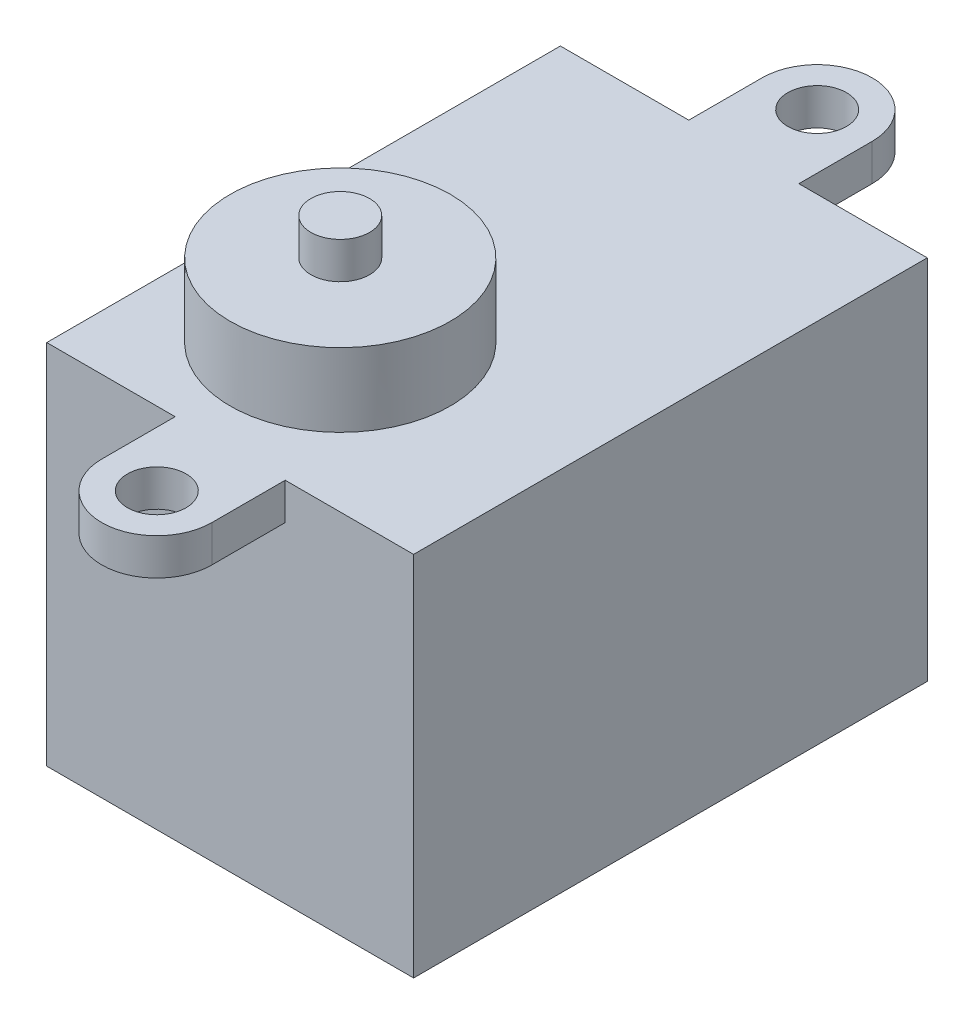
ISO-10303-21;
HEADER;
FILE_DESCRIPTION(('STEP AP214'),'2;1');
FILE_NAME('part.step','',(''),(''),'','','');
FILE_SCHEMA(('AUTOMOTIVE_DESIGN { 1 0 10303 214 1 1 1 1 }'));
ENDSEC;
DATA;
#1=APPLICATION_CONTEXT('core data for automotive mechanical design processes');
#2=APPLICATION_PROTOCOL_DEFINITION('international standard','automotive_design',2000,#1);
#3=PRODUCT_CONTEXT('',#1,'mechanical');
#4=PRODUCT('Part','Part','',(#3));
#5=PRODUCT_RELATED_PRODUCT_CATEGORY('part','',(#4));
#6=PRODUCT_DEFINITION_FORMATION('','',#4);
#7=PRODUCT_DEFINITION_CONTEXT('part definition',#1,'design');
#8=PRODUCT_DEFINITION('design','',#6,#7);
#9=PRODUCT_DEFINITION_SHAPE('','',#8);
#10=(LENGTH_UNIT() NAMED_UNIT(*) SI_UNIT(.MILLI.,.METRE.));
#11=(NAMED_UNIT(*) PLANE_ANGLE_UNIT() SI_UNIT($,.RADIAN.));
#12=(NAMED_UNIT(*) SI_UNIT($,.STERADIAN.) SOLID_ANGLE_UNIT());
#13=UNCERTAINTY_MEASURE_WITH_UNIT(LENGTH_MEASURE(1.E-05),#10,'distance_accuracy_value','');
#14=(GEOMETRIC_REPRESENTATION_CONTEXT(3) GLOBAL_UNCERTAINTY_ASSIGNED_CONTEXT((#13)) GLOBAL_UNIT_ASSIGNED_CONTEXT((#10,
#11,#12)) REPRESENTATION_CONTEXT('',''));
#15=CARTESIAN_POINT('',(0.,0.,0.));
#16=DIRECTION('',(0.,0.,1.));
#17=DIRECTION('',(1.,0.,0.));
#18=AXIS2_PLACEMENT_3D('',#15,#16,#17);
#19=CARTESIAN_POINT('',(0.,50.,0.));
#20=DIRECTION('',(0.,0.,-1.));
#21=DIRECTION('',(-1.,0.,0.));
#22=AXIS2_PLACEMENT_3D('',#19,#20,#21);
#23=PLANE('',#22);
#24=DIRECTION('',(0.,1.,0.));
#25=VECTOR('',#24,1.);
#26=CARTESIAN_POINT('',(32.5,45.,0.));
#27=LINE('',#26,#25);
#28=CARTESIAN_POINT('',(32.5,45.,0.));
#29=VERTEX_POINT('',#28);
#30=CARTESIAN_POINT('',(32.5,50.,0.));
#31=VERTEX_POINT('',#30);
#32=EDGE_CURVE('E189',#29,#31,#27,.T.);
#33=ORIENTED_EDGE('',*,*,#32,.F.);
#34=DIRECTION('',(1.,0.,0.));
#35=VECTOR('',#34,1.);
#36=CARTESIAN_POINT('',(17.5,45.,0.));
#37=LINE('',#36,#35);
#38=CARTESIAN_POINT('',(17.5,45.,0.));
#39=VERTEX_POINT('',#38);
#40=EDGE_CURVE('E169',#39,#29,#37,.T.);
#41=ORIENTED_EDGE('',*,*,#40,.F.);
#42=DIRECTION('',(0.,1.,0.));
#43=VECTOR('',#42,1.);
#44=CARTESIAN_POINT('',(17.5,45.,0.));
#45=LINE('',#44,#43);
#46=CARTESIAN_POINT('',(17.5,50.,0.));
#47=VERTEX_POINT('',#46);
#48=EDGE_CURVE('E172',#39,#47,#45,.T.);
#49=ORIENTED_EDGE('',*,*,#48,.T.);
#50=DIRECTION('',(1.,0.,0.));
#51=VECTOR('',#50,1.);
#52=CARTESIAN_POINT('',(0.,50.,0.));
#53=LINE('',#52,#51);
#54=CARTESIAN_POINT('',(0.,50.,0.));
#55=VERTEX_POINT('',#54);
#56=EDGE_CURVE('E203',#55,#47,#53,.T.);
#57=ORIENTED_EDGE('',*,*,#56,.F.);
#58=DIRECTION('',(0.,-1.,0.));
#59=VECTOR('',#58,1.);
#60=CARTESIAN_POINT('',(0.,50.,0.));
#61=LINE('',#60,#59);
#62=CARTESIAN_POINT('',(0.,0.,0.));
#63=VERTEX_POINT('',#62);
#64=EDGE_CURVE('E273',#55,#63,#61,.T.);
#65=ORIENTED_EDGE('',*,*,#64,.T.);
#66=DIRECTION('',(1.,0.,0.));
#67=VECTOR('',#66,1.);
#68=CARTESIAN_POINT('',(0.,0.,0.));
#69=LINE('',#68,#67);
#70=CARTESIAN_POINT('',(50.,0.,0.));
#71=VERTEX_POINT('',#70);
#72=EDGE_CURVE('E287',#63,#71,#69,.T.);
#73=ORIENTED_EDGE('',*,*,#72,.T.);
#74=DIRECTION('',(0.,-1.,0.));
#75=VECTOR('',#74,1.);
#76=CARTESIAN_POINT('',(50.,50.,0.));
#77=LINE('',#76,#75);
#78=CARTESIAN_POINT('',(50.,50.,0.));
#79=VERTEX_POINT('',#78);
#80=EDGE_CURVE('E276',#79,#71,#77,.T.);
#81=ORIENTED_EDGE('',*,*,#80,.F.);
#82=EDGE_CURVE('E207',#31,#79,#53,.T.);
#83=ORIENTED_EDGE('',*,*,#82,.F.);
#84=EDGE_LOOP('',(#33,#41,#49,#57,#65,#73,#81,#83));
#85=FACE_BOUND('',#84,.T.);
#86=ADVANCED_FACE('F35',(#85),#23,.F.);
#87=CARTESIAN_POINT('',(0.,50.,-70.));
#88=DIRECTION('',(0.,0.,1.));
#89=DIRECTION('',(1.,0.,0.));
#90=AXIS2_PLACEMENT_3D('',#87,#88,#89);
#91=PLANE('',#90);
#92=DIRECTION('',(0.,1.,0.));
#93=VECTOR('',#92,1.);
#94=CARTESIAN_POINT('',(17.5,45.,-70.));
#95=LINE('',#94,#93);
#96=CARTESIAN_POINT('',(17.5,45.,-70.));
#97=VERTEX_POINT('',#96);
#98=CARTESIAN_POINT('',(17.5,50.,-70.));
#99=VERTEX_POINT('',#98);
#100=EDGE_CURVE('E314',#97,#99,#95,.T.);
#101=ORIENTED_EDGE('',*,*,#100,.F.);
#102=DIRECTION('',(1.,0.,0.));
#103=VECTOR('',#102,1.);
#104=CARTESIAN_POINT('',(17.5,45.,-70.));
#105=LINE('',#104,#103);
#106=CARTESIAN_POINT('',(32.5,45.,-70.));
#107=VERTEX_POINT('',#106);
#108=EDGE_CURVE('E338',#97,#107,#105,.T.);
#109=ORIENTED_EDGE('',*,*,#108,.T.);
#110=DIRECTION('',(0.,1.,0.));
#111=VECTOR('',#110,1.);
#112=CARTESIAN_POINT('',(32.5,45.,-70.));
#113=LINE('',#112,#111);
#114=CARTESIAN_POINT('',(32.5,50.,-70.));
#115=VERTEX_POINT('',#114);
#116=EDGE_CURVE('E311',#107,#115,#113,.T.);
#117=ORIENTED_EDGE('',*,*,#116,.T.);
#118=DIRECTION('',(-1.,0.,0.));
#119=VECTOR('',#118,1.);
#120=CARTESIAN_POINT('',(0.,50.,-70.));
#121=LINE('',#120,#119);
#122=CARTESIAN_POINT('',(50.,50.,-70.));
#123=VERTEX_POINT('',#122);
#124=EDGE_CURVE('E228',#123,#115,#121,.T.);
#125=ORIENTED_EDGE('',*,*,#124,.F.);
#126=DIRECTION('',(0.,-1.,0.));
#127=VECTOR('',#126,1.);
#128=CARTESIAN_POINT('',(50.,50.,-70.));
#129=LINE('',#128,#127);
#130=CARTESIAN_POINT('',(50.,0.,-70.));
#131=VERTEX_POINT('',#130);
#132=EDGE_CURVE('E279',#123,#131,#129,.T.);
#133=ORIENTED_EDGE('',*,*,#132,.T.);
#134=DIRECTION('',(-1.,0.,0.));
#135=VECTOR('',#134,1.);
#136=CARTESIAN_POINT('',(0.,0.,-70.));
#137=LINE('',#136,#135);
#138=CARTESIAN_POINT('',(0.,0.,-70.));
#139=VERTEX_POINT('',#138);
#140=EDGE_CURVE('E284',#131,#139,#137,.T.);
#141=ORIENTED_EDGE('',*,*,#140,.T.);
#142=DIRECTION('',(0.,-1.,0.));
#143=VECTOR('',#142,1.);
#144=CARTESIAN_POINT('',(0.,50.,-70.));
#145=LINE('',#144,#143);
#146=CARTESIAN_POINT('',(0.,50.,-70.));
#147=VERTEX_POINT('',#146);
#148=EDGE_CURVE('E231',#147,#139,#145,.T.);
#149=ORIENTED_EDGE('',*,*,#148,.F.);
#150=EDGE_CURVE('E219',#99,#147,#121,.T.);
#151=ORIENTED_EDGE('',*,*,#150,.F.);
#152=EDGE_LOOP('',(#101,#109,#117,#125,#133,#141,#149,#151));
#153=FACE_BOUND('',#152,.T.);
#154=ADVANCED_FACE('F367',(#153),#91,.F.);
#155=CARTESIAN_POINT('',(20.,60.,-20.));
#156=DIRECTION('',(0.,1.,0.));
#157=DIRECTION('',(0.,0.,1.));
#158=AXIS2_PLACEMENT_3D('',#155,#156,#157);
#159=PLANE('',#158);
#160=CARTESIAN_POINT('',(20.,60.,-20.));
#161=DIRECTION('',(0.,1.,0.));
#162=DIRECTION('',(0.,0.,1.));
#163=AXIS2_PLACEMENT_3D('',#160,#161,#162);
#164=CIRCLE('',#163,15.);
#165=CARTESIAN_POINT('',(20.,60.,-5.));
#166=VERTEX_POINT('',#165);
#167=EDGE_CURVE('E291',#166,#166,#164,.T.);
#168=ORIENTED_EDGE('',*,*,#167,.T.);
#169=EDGE_LOOP('',(#168));
#170=FACE_BOUND('',#169,.T.);
#171=CARTESIAN_POINT('',(20.,60.,-20.));
#172=DIRECTION('',(0.,1.,0.));
#173=DIRECTION('',(0.,0.,1.));
#174=AXIS2_PLACEMENT_3D('',#171,#172,#173);
#175=CIRCLE('',#174,4.);
#176=CARTESIAN_POINT('',(20.,60.,-16.));
#177=VERTEX_POINT('',#176);
#178=EDGE_CURVE('E300',#177,#177,#175,.T.);
#179=ORIENTED_EDGE('',*,*,#178,.F.);
#180=EDGE_LOOP('',(#179));
#181=FACE_BOUND('',#180,.T.);
#182=ADVANCED_FACE('F372',(#170,#181),#159,.T.);
#183=CARTESIAN_POINT('',(0.,50.,0.));
#184=DIRECTION('',(0.,-1.,0.));
#185=DIRECTION('',(0.,0.,-1.));
#186=AXIS2_PLACEMENT_3D('',#183,#184,#185);
#187=PLANE('',#186);
#188=DIRECTION('',(0.,0.,1.));
#189=VECTOR('',#188,1.);
#190=CARTESIAN_POINT('',(0.,50.,0.));
#191=LINE('',#190,#189);
#192=EDGE_CURVE('E210',#147,#55,#191,.T.);
#193=ORIENTED_EDGE('',*,*,#192,.T.);
#194=ORIENTED_EDGE('',*,*,#56,.T.);
#195=DIRECTION('',(0.,0.,-1.));
#196=VECTOR('',#195,1.);
#197=CARTESIAN_POINT('',(17.5,50.,0.));
#198=LINE('',#197,#196);
#199=CARTESIAN_POINT('',(17.5,50.,9.99999999999999));
#200=VERTEX_POINT('',#199);
#201=EDGE_CURVE('E53',#200,#47,#198,.T.);
#202=ORIENTED_EDGE('',*,*,#201,.F.);
#203=CARTESIAN_POINT('',(25.,50.,9.99999999999999));
#204=DIRECTION('',(0.,-1.,0.));
#205=DIRECTION('',(0.,0.,-1.));
#206=AXIS2_PLACEMENT_3D('',#203,#204,#205);
#207=CIRCLE('',#206,7.5);
#208=CARTESIAN_POINT('',(32.5,50.,9.99999999999999));
#209=VERTEX_POINT('',#208);
#210=EDGE_CURVE('E167',#209,#200,#207,.T.);
#211=ORIENTED_EDGE('',*,*,#210,.F.);
#212=DIRECTION('',(0.,0.,1.));
#213=VECTOR('',#212,1.);
#214=CARTESIAN_POINT('',(32.5,50.,0.));
#215=LINE('',#214,#213);
#216=EDGE_CURVE('E174',#31,#209,#215,.T.);
#217=ORIENTED_EDGE('',*,*,#216,.F.);
#218=ORIENTED_EDGE('',*,*,#82,.T.);
#219=DIRECTION('',(0.,0.,-1.));
#220=VECTOR('',#219,1.);
#221=CARTESIAN_POINT('',(50.,50.,0.));
#222=LINE('',#221,#220);
#223=EDGE_CURVE('E216',#79,#123,#222,.T.);
#224=ORIENTED_EDGE('',*,*,#223,.T.);
#225=ORIENTED_EDGE('',*,*,#124,.T.);
#226=DIRECTION('',(0.,0.,-1.));
#227=VECTOR('',#226,1.);
#228=CARTESIAN_POINT('',(32.5,50.,-70.));
#229=LINE('',#228,#227);
#230=CARTESIAN_POINT('',(32.5,50.,-80.));
#231=VERTEX_POINT('',#230);
#232=EDGE_CURVE('E61',#115,#231,#229,.T.);
#233=ORIENTED_EDGE('',*,*,#232,.T.);
#234=CARTESIAN_POINT('',(25.,50.,-80.));
#235=DIRECTION('',(0.,1.,0.));
#236=DIRECTION('',(0.,0.,1.));
#237=AXIS2_PLACEMENT_3D('',#234,#235,#236);
#238=CIRCLE('',#237,7.5);
#239=CARTESIAN_POINT('',(17.5,50.,-80.));
#240=VERTEX_POINT('',#239);
#241=EDGE_CURVE('E327',#231,#240,#238,.T.);
#242=ORIENTED_EDGE('',*,*,#241,.T.);
#243=DIRECTION('',(0.,0.,1.));
#244=VECTOR('',#243,1.);
#245=CARTESIAN_POINT('',(17.5,50.,-70.));
#246=LINE('',#245,#244);
#247=EDGE_CURVE('E320',#240,#99,#246,.T.);
#248=ORIENTED_EDGE('',*,*,#247,.T.);
#249=ORIENTED_EDGE('',*,*,#150,.T.);
#250=EDGE_LOOP('',(#193,#194,#202,#211,#217,#218,#224,#225,#233,#242,#248,#249));
#251=FACE_BOUND('',#250,.T.);
#252=CARTESIAN_POINT('',(20.,50.,-20.));
#253=DIRECTION('',(0.,-1.,0.));
#254=DIRECTION('',(0.,0.,-1.));
#255=AXIS2_PLACEMENT_3D('',#252,#253,#254);
#256=CIRCLE('',#255,15.);
#257=CARTESIAN_POINT('',(20.,50.,-35.));
#258=VERTEX_POINT('',#257);
#259=EDGE_CURVE('E236',#258,#258,#256,.F.);
#260=ORIENTED_EDGE('',*,*,#259,.F.);
#261=EDGE_LOOP('',(#260));
#262=FACE_BOUND('',#261,.T.);
#263=CARTESIAN_POINT('',(25.,50.,-80.));
#264=DIRECTION('',(0.,1.,0.));
#265=DIRECTION('',(0.,0.,1.));
#266=AXIS2_PLACEMENT_3D('',#263,#264,#265);
#267=CIRCLE('',#266,4.);
#268=CARTESIAN_POINT('',(25.,50.,-76.));
#269=VERTEX_POINT('',#268);
#270=EDGE_CURVE('E188',#269,#269,#267,.T.);
#271=ORIENTED_EDGE('',*,*,#270,.F.);
#272=EDGE_LOOP('',(#271));
#273=FACE_BOUND('',#272,.T.);
#274=CARTESIAN_POINT('',(25.,50.,9.99999999999999));
#275=DIRECTION('',(0.,-1.,0.));
#276=DIRECTION('',(0.,0.,-1.));
#277=AXIS2_PLACEMENT_3D('',#274,#275,#276);
#278=CIRCLE('',#277,4.);
#279=CARTESIAN_POINT('',(25.,50.,5.99999999999999));
#280=VERTEX_POINT('',#279);
#281=EDGE_CURVE('E177',#280,#280,#278,.T.);
#282=ORIENTED_EDGE('',*,*,#281,.T.);
#283=EDGE_LOOP('',(#282));
#284=FACE_BOUND('',#283,.T.);
#285=ADVANCED_FACE('F199',(#251,#262,#273,#284),#187,.F.);
#286=CARTESIAN_POINT('',(0.,50.,0.));
#287=DIRECTION('',(1.,0.,0.));
#288=DIRECTION('',(0.,0.,-1.));
#289=AXIS2_PLACEMENT_3D('',#286,#287,#288);
#290=PLANE('',#289);
#291=DIRECTION('',(0.,0.,1.));
#292=VECTOR('',#291,1.);
#293=CARTESIAN_POINT('',(0.,0.,0.));
#294=LINE('',#293,#292);
#295=EDGE_CURVE('E222',#139,#63,#294,.T.);
#296=ORIENTED_EDGE('',*,*,#295,.T.);
#297=ORIENTED_EDGE('',*,*,#64,.F.);
#298=ORIENTED_EDGE('',*,*,#192,.F.);
#299=ORIENTED_EDGE('',*,*,#148,.T.);
#300=EDGE_LOOP('',(#296,#297,#298,#299));
#301=FACE_BOUND('',#300,.T.);
#302=ADVANCED_FACE('F378',(#301),#290,.F.);
#303=CARTESIAN_POINT('',(50.,50.,0.));
#304=DIRECTION('',(-1.,0.,0.));
#305=DIRECTION('',(0.,0.,1.));
#306=AXIS2_PLACEMENT_3D('',#303,#304,#305);
#307=PLANE('',#306);
#308=DIRECTION('',(0.,0.,-1.));
#309=VECTOR('',#308,1.);
#310=CARTESIAN_POINT('',(50.,0.,0.));
#311=LINE('',#310,#309);
#312=EDGE_CURVE('E286',#71,#131,#311,.T.);
#313=ORIENTED_EDGE('',*,*,#312,.T.);
#314=ORIENTED_EDGE('',*,*,#132,.F.);
#315=ORIENTED_EDGE('',*,*,#223,.F.);
#316=ORIENTED_EDGE('',*,*,#80,.T.);
#317=EDGE_LOOP('',(#313,#314,#315,#316));
#318=FACE_BOUND('',#317,.T.);
#319=ADVANCED_FACE('F377',(#318),#307,.F.);
#320=CARTESIAN_POINT('',(0.,0.,0.));
#321=DIRECTION('',(0.,-1.,0.));
#322=DIRECTION('',(0.,0.,-1.));
#323=AXIS2_PLACEMENT_3D('',#320,#321,#322);
#324=PLANE('',#323);
#325=ORIENTED_EDGE('',*,*,#295,.F.);
#326=ORIENTED_EDGE('',*,*,#140,.F.);
#327=ORIENTED_EDGE('',*,*,#312,.F.);
#328=ORIENTED_EDGE('',*,*,#72,.F.);
#329=EDGE_LOOP('',(#325,#326,#327,#328));
#330=FACE_BOUND('',#329,.T.);
#331=ADVANCED_FACE('F608',(#330),#324,.T.);
#332=CARTESIAN_POINT('',(20.,60.,-20.));
#333=DIRECTION('',(0.,-1.,0.));
#334=DIRECTION('',(0.,0.,-1.));
#335=AXIS2_PLACEMENT_3D('',#332,#333,#334);
#336=CYLINDRICAL_SURFACE('',#335,15.);
#337=ORIENTED_EDGE('',*,*,#167,.F.);
#338=EDGE_LOOP('',(#337));
#339=FACE_BOUND('',#338,.T.);
#340=ORIENTED_EDGE('',*,*,#259,.T.);
#341=EDGE_LOOP('',(#340));
#342=FACE_BOUND('',#341,.T.);
#343=ADVANCED_FACE('F593',(#339,#342),#336,.T.);
#344=CARTESIAN_POINT('',(20.,65.,-20.));
#345=DIRECTION('',(0.,-1.,0.));
#346=DIRECTION('',(0.,0.,-1.));
#347=AXIS2_PLACEMENT_3D('',#344,#345,#346);
#348=CYLINDRICAL_SURFACE('',#347,4.);
#349=CARTESIAN_POINT('',(20.,65.,-20.));
#350=DIRECTION('',(0.,1.,0.));
#351=DIRECTION('',(0.,0.,1.));
#352=AXIS2_PLACEMENT_3D('',#349,#350,#351);
#353=CIRCLE('',#352,4.);
#354=CARTESIAN_POINT('',(20.,65.,-16.));
#355=VERTEX_POINT('',#354);
#356=EDGE_CURVE('E296',#355,#355,#353,.T.);
#357=ORIENTED_EDGE('',*,*,#356,.F.);
#358=EDGE_LOOP('',(#357));
#359=FACE_BOUND('',#358,.T.);
#360=ORIENTED_EDGE('',*,*,#178,.T.);
#361=EDGE_LOOP('',(#360));
#362=FACE_BOUND('',#361,.T.);
#363=ADVANCED_FACE('F584',(#359,#362),#348,.T.);
#364=CARTESIAN_POINT('',(20.,65.,-20.));
#365=DIRECTION('',(0.,1.,0.));
#366=DIRECTION('',(0.,0.,1.));
#367=AXIS2_PLACEMENT_3D('',#364,#365,#366);
#368=PLANE('',#367);
#369=ORIENTED_EDGE('',*,*,#356,.T.);
#370=EDGE_LOOP('',(#369));
#371=FACE_BOUND('',#370,.T.);
#372=ADVANCED_FACE('F362',(#371),#368,.T.);
#373=CARTESIAN_POINT('',(17.5,45.,-70.));
#374=DIRECTION('',(-1.,0.,0.));
#375=DIRECTION('',(0.,0.,1.));
#376=AXIS2_PLACEMENT_3D('',#373,#374,#375);
#377=PLANE('',#376);
#378=ORIENTED_EDGE('',*,*,#247,.F.);
#379=DIRECTION('',(0.,1.,0.));
#380=VECTOR('',#379,1.);
#381=CARTESIAN_POINT('',(17.5,45.,-80.));
#382=LINE('',#381,#380);
#383=CARTESIAN_POINT('',(17.5,45.,-80.));
#384=VERTEX_POINT('',#383);
#385=EDGE_CURVE('E304',#384,#240,#382,.T.);
#386=ORIENTED_EDGE('',*,*,#385,.F.);
#387=DIRECTION('',(0.,0.,1.));
#388=VECTOR('',#387,1.);
#389=CARTESIAN_POINT('',(17.5,45.,-70.));
#390=LINE('',#389,#388);
#391=EDGE_CURVE('E335',#384,#97,#390,.T.);
#392=ORIENTED_EDGE('',*,*,#391,.T.);
#393=ORIENTED_EDGE('',*,*,#100,.T.);
#394=EDGE_LOOP('',(#378,#386,#392,#393));
#395=FACE_BOUND('',#394,.T.);
#396=ADVANCED_FACE('F354',(#395),#377,.T.);
#397=CARTESIAN_POINT('',(25.,45.,-80.));
#398=DIRECTION('',(0.,1.,0.));
#399=DIRECTION('',(0.,0.,1.));
#400=AXIS2_PLACEMENT_3D('',#397,#398,#399);
#401=CYLINDRICAL_SURFACE('',#400,7.5);
#402=ORIENTED_EDGE('',*,*,#241,.F.);
#403=DIRECTION('',(0.,1.,0.));
#404=VECTOR('',#403,1.);
#405=CARTESIAN_POINT('',(32.5,45.,-80.));
#406=LINE('',#405,#404);
#407=CARTESIAN_POINT('',(32.5,45.,-80.));
#408=VERTEX_POINT('',#407);
#409=EDGE_CURVE('E308',#408,#231,#406,.T.);
#410=ORIENTED_EDGE('',*,*,#409,.F.);
#411=CARTESIAN_POINT('',(25.,45.,-80.));
#412=DIRECTION('',(0.,1.,0.));
#413=DIRECTION('',(0.,0.,1.));
#414=AXIS2_PLACEMENT_3D('',#411,#412,#413);
#415=CIRCLE('',#414,7.5);
#416=EDGE_CURVE('E317',#408,#384,#415,.T.);
#417=ORIENTED_EDGE('',*,*,#416,.T.);
#418=ORIENTED_EDGE('',*,*,#385,.T.);
#419=EDGE_LOOP('',(#402,#410,#417,#418));
#420=FACE_BOUND('',#419,.T.);
#421=ADVANCED_FACE('F352',(#420),#401,.T.);
#422=CARTESIAN_POINT('',(32.5,45.,-70.));
#423=DIRECTION('',(1.,0.,0.));
#424=DIRECTION('',(0.,0.,-1.));
#425=AXIS2_PLACEMENT_3D('',#422,#423,#424);
#426=PLANE('',#425);
#427=ORIENTED_EDGE('',*,*,#232,.F.);
#428=ORIENTED_EDGE('',*,*,#116,.F.);
#429=DIRECTION('',(0.,0.,-1.));
#430=VECTOR('',#429,1.);
#431=CARTESIAN_POINT('',(32.5,45.,-70.));
#432=LINE('',#431,#430);
#433=EDGE_CURVE('E341',#107,#408,#432,.T.);
#434=ORIENTED_EDGE('',*,*,#433,.T.);
#435=ORIENTED_EDGE('',*,*,#409,.T.);
#436=EDGE_LOOP('',(#427,#428,#434,#435));
#437=FACE_BOUND('',#436,.T.);
#438=ADVANCED_FACE('F348',(#437),#426,.T.);
#439=CARTESIAN_POINT('',(25.,45.,-80.));
#440=DIRECTION('',(0.,1.,0.));
#441=DIRECTION('',(0.,0.,1.));
#442=AXIS2_PLACEMENT_3D('',#439,#440,#441);
#443=PLANE('',#442);
#444=CARTESIAN_POINT('',(25.,45.,-80.));
#445=DIRECTION('',(0.,1.,0.));
#446=DIRECTION('',(0.,0.,1.));
#447=AXIS2_PLACEMENT_3D('',#444,#445,#446);
#448=CIRCLE('',#447,4.);
#449=CARTESIAN_POINT('',(25.,45.,-76.));
#450=VERTEX_POINT('',#449);
#451=EDGE_CURVE('E322',#450,#450,#448,.T.);
#452=ORIENTED_EDGE('',*,*,#451,.T.);
#453=EDGE_LOOP('',(#452));
#454=FACE_BOUND('',#453,.T.);
#455=ORIENTED_EDGE('',*,*,#391,.F.);
#456=ORIENTED_EDGE('',*,*,#416,.F.);
#457=ORIENTED_EDGE('',*,*,#433,.F.);
#458=ORIENTED_EDGE('',*,*,#108,.F.);
#459=EDGE_LOOP('',(#455,#456,#457,#458));
#460=FACE_BOUND('',#459,.T.);
#461=ADVANCED_FACE('F360',(#454,#460),#443,.F.);
#462=CARTESIAN_POINT('',(25.,45.,-80.));
#463=DIRECTION('',(0.,1.,0.));
#464=DIRECTION('',(0.,0.,1.));
#465=AXIS2_PLACEMENT_3D('',#462,#463,#464);
#466=CYLINDRICAL_SURFACE('',#465,4.);
#467=ORIENTED_EDGE('',*,*,#451,.F.);
#468=EDGE_LOOP('',(#467));
#469=FACE_BOUND('',#468,.T.);
#470=ORIENTED_EDGE('',*,*,#270,.T.);
#471=EDGE_LOOP('',(#470));
#472=FACE_BOUND('',#471,.T.);
#473=ADVANCED_FACE('F463',(#469,#472),#466,.F.);
#474=CARTESIAN_POINT('',(25.,45.,9.99999999999999));
#475=DIRECTION('',(0.,1.,0.));
#476=DIRECTION('',(0.,0.,-1.));
#477=AXIS2_PLACEMENT_3D('',#474,#475,#476);
#478=PLANE('',#477);
#479=DIRECTION('',(0.,0.,-1.));
#480=VECTOR('',#479,1.);
#481=CARTESIAN_POINT('',(17.5,45.,0.));
#482=LINE('',#481,#480);
#483=CARTESIAN_POINT('',(17.5,45.,9.99999999999999));
#484=VERTEX_POINT('',#483);
#485=EDGE_CURVE('E157',#484,#39,#482,.T.);
#486=ORIENTED_EDGE('',*,*,#485,.T.);
#487=ORIENTED_EDGE('',*,*,#40,.T.);
#488=DIRECTION('',(0.,0.,1.));
#489=VECTOR('',#488,1.);
#490=CARTESIAN_POINT('',(32.5,45.,0.));
#491=LINE('',#490,#489);
#492=CARTESIAN_POINT('',(32.5,45.,9.99999999999999));
#493=VERTEX_POINT('',#492);
#494=EDGE_CURVE('E159',#29,#493,#491,.T.);
#495=ORIENTED_EDGE('',*,*,#494,.T.);
#496=CARTESIAN_POINT('',(25.,45.,9.99999999999999));
#497=DIRECTION('',(0.,-1.,0.));
#498=DIRECTION('',(0.,0.,-1.));
#499=AXIS2_PLACEMENT_3D('',#496,#497,#498);
#500=CIRCLE('',#499,7.5);
#501=EDGE_CURVE('E152',#493,#484,#500,.T.);
#502=ORIENTED_EDGE('',*,*,#501,.T.);
#503=EDGE_LOOP('',(#486,#487,#495,#502));
#504=FACE_BOUND('',#503,.T.);
#505=CARTESIAN_POINT('',(25.,45.,9.99999999999999));
#506=DIRECTION('',(0.,-1.,0.));
#507=DIRECTION('',(0.,0.,-1.));
#508=AXIS2_PLACEMENT_3D('',#505,#506,#507);
#509=CIRCLE('',#508,4.);
#510=CARTESIAN_POINT('',(25.,45.,5.99999999999999));
#511=VERTEX_POINT('',#510);
#512=EDGE_CURVE('E204',#511,#511,#509,.T.);
#513=ORIENTED_EDGE('',*,*,#512,.F.);
#514=EDGE_LOOP('',(#513));
#515=FACE_BOUND('',#514,.T.);
#516=ADVANCED_FACE('F154',(#504,#515),#478,.F.);
#517=CARTESIAN_POINT('',(17.5,45.,0.));
#518=DIRECTION('',(1.,0.,0.));
#519=DIRECTION('',(0.,0.,-1.));
#520=AXIS2_PLACEMENT_3D('',#517,#518,#519);
#521=PLANE('',#520);
#522=ORIENTED_EDGE('',*,*,#201,.T.);
#523=ORIENTED_EDGE('',*,*,#48,.F.);
#524=ORIENTED_EDGE('',*,*,#485,.F.);
#525=DIRECTION('',(0.,1.,0.));
#526=VECTOR('',#525,1.);
#527=CARTESIAN_POINT('',(17.5,45.,9.99999999999999));
#528=LINE('',#527,#526);
#529=EDGE_CURVE('E164',#484,#200,#528,.T.);
#530=ORIENTED_EDGE('',*,*,#529,.T.);
#531=EDGE_LOOP('',(#522,#523,#524,#530));
#532=FACE_BOUND('',#531,.T.);
#533=ADVANCED_FACE('F171',(#532),#521,.F.);
#534=CARTESIAN_POINT('',(32.5,45.,0.));
#535=DIRECTION('',(-1.,0.,0.));
#536=DIRECTION('',(0.,0.,1.));
#537=AXIS2_PLACEMENT_3D('',#534,#535,#536);
#538=PLANE('',#537);
#539=ORIENTED_EDGE('',*,*,#216,.T.);
#540=DIRECTION('',(0.,1.,0.));
#541=VECTOR('',#540,1.);
#542=CARTESIAN_POINT('',(32.5,45.,9.99999999999999));
#543=LINE('',#542,#541);
#544=EDGE_CURVE('E168',#493,#209,#543,.T.);
#545=ORIENTED_EDGE('',*,*,#544,.F.);
#546=ORIENTED_EDGE('',*,*,#494,.F.);
#547=ORIENTED_EDGE('',*,*,#32,.T.);
#548=EDGE_LOOP('',(#539,#545,#546,#547));
#549=FACE_BOUND('',#548,.T.);
#550=ADVANCED_FACE('F500',(#549),#538,.F.);
#551=CARTESIAN_POINT('',(25.,45.,9.99999999999999));
#552=DIRECTION('',(0.,1.,0.));
#553=DIRECTION('',(0.,0.,1.));
#554=AXIS2_PLACEMENT_3D('',#551,#552,#553);
#555=CYLINDRICAL_SURFACE('',#554,7.5);
#556=ORIENTED_EDGE('',*,*,#210,.T.);
#557=ORIENTED_EDGE('',*,*,#529,.F.);
#558=ORIENTED_EDGE('',*,*,#501,.F.);
#559=ORIENTED_EDGE('',*,*,#544,.T.);
#560=EDGE_LOOP('',(#556,#557,#558,#559));
#561=FACE_BOUND('',#560,.T.);
#562=ADVANCED_FACE('F165',(#561),#555,.T.);
#563=CARTESIAN_POINT('',(25.,45.,9.99999999999999));
#564=DIRECTION('',(0.,1.,0.));
#565=DIRECTION('',(0.,0.,1.));
#566=AXIS2_PLACEMENT_3D('',#563,#564,#565);
#567=CYLINDRICAL_SURFACE('',#566,4.);
#568=ORIENTED_EDGE('',*,*,#512,.T.);
#569=EDGE_LOOP('',(#568));
#570=FACE_BOUND('',#569,.T.);
#571=ORIENTED_EDGE('',*,*,#281,.F.);
#572=EDGE_LOOP('',(#571));
#573=FACE_BOUND('',#572,.T.);
#574=ADVANCED_FACE('F517',(#570,#573),#567,.F.);
#575=CLOSED_SHELL('',(#86,#154,#182,#285,#302,#319,#331,#343,#363,#372,#396,#421,#438,#461,#473,
#516,#533,#550,#562,#574));
#576=CARTESIAN_POINT('',(20.,58.,-20.));
#577=DIRECTION('',(0.,1.,0.));
#578=DIRECTION('',(0.,0.,1.));
#579=AXIS2_PLACEMENT_3D('',#576,#577,#578);
#580=PLANE('',#579);
#581=CARTESIAN_POINT('',(20.,58.,-20.));
#582=DIRECTION('',(0.,1.,0.));
#583=DIRECTION('',(0.,0.,1.));
#584=AXIS2_PLACEMENT_3D('',#581,#582,#583);
#585=CIRCLE('',#584,13.);
#586=CARTESIAN_POINT('',(20.,58.,-7.));
#587=VERTEX_POINT('',#586);
#588=EDGE_CURVE('E232',#587,#587,#585,.T.);
#589=ORIENTED_EDGE('',*,*,#588,.F.);
#590=EDGE_LOOP('',(#589));
#591=FACE_BOUND('',#590,.T.);
#592=CARTESIAN_POINT('',(20.,58.,-20.));
#593=DIRECTION('',(0.,1.,0.));
#594=DIRECTION('',(0.,0.,1.));
#595=AXIS2_PLACEMENT_3D('',#592,#593,#594);
#596=CIRCLE('',#595,2.);
#597=CARTESIAN_POINT('',(20.,58.,-18.));
#598=VERTEX_POINT('',#597);
#599=EDGE_CURVE('E45',#598,#598,#596,.T.);
#600=ORIENTED_EDGE('',*,*,#599,.T.);
#601=EDGE_LOOP('',(#600));
#602=FACE_BOUND('',#601,.T.);
#603=ADVANCED_FACE('F381',(#591,#602),#580,.F.);
#604=CARTESIAN_POINT('',(0.,48.,0.));
#605=DIRECTION('',(0.,-1.,0.));
#606=DIRECTION('',(0.,0.,-1.));
#607=AXIS2_PLACEMENT_3D('',#604,#605,#606);
#608=PLANE('',#607);
#609=DIRECTION('',(0.,0.,1.));
#610=VECTOR('',#609,1.);
#611=CARTESIAN_POINT('',(2.,48.,0.));
#612=LINE('',#611,#610);
#613=CARTESIAN_POINT('',(2.,48.,-68.));
#614=VERTEX_POINT('',#613);
#615=CARTESIAN_POINT('',(2.,48.,-2.));
#616=VERTEX_POINT('',#615);
#617=EDGE_CURVE('E235',#614,#616,#612,.T.);
#618=ORIENTED_EDGE('',*,*,#617,.F.);
#619=DIRECTION('',(-1.,0.,0.));
#620=VECTOR('',#619,1.);
#621=CARTESIAN_POINT('',(0.,48.,-68.));
#622=LINE('',#621,#620);
#623=CARTESIAN_POINT('',(48.,48.,-68.));
#624=VERTEX_POINT('',#623);
#625=EDGE_CURVE('E243',#624,#614,#622,.T.);
#626=ORIENTED_EDGE('',*,*,#625,.F.);
#627=DIRECTION('',(0.,0.,-1.));
#628=VECTOR('',#627,1.);
#629=CARTESIAN_POINT('',(48.,48.,0.));
#630=LINE('',#629,#628);
#631=CARTESIAN_POINT('',(48.,48.,-2.));
#632=VERTEX_POINT('',#631);
#633=EDGE_CURVE('E241',#632,#624,#630,.T.);
#634=ORIENTED_EDGE('',*,*,#633,.F.);
#635=DIRECTION('',(1.,0.,0.));
#636=VECTOR('',#635,1.);
#637=CARTESIAN_POINT('',(0.,48.,-2.));
#638=LINE('',#637,#636);
#639=EDGE_CURVE('E239',#616,#632,#638,.T.);
#640=ORIENTED_EDGE('',*,*,#639,.F.);
#641=EDGE_LOOP('',(#618,#626,#634,#640));
#642=FACE_BOUND('',#641,.T.);
#643=CARTESIAN_POINT('',(20.,48.,-20.));
#644=DIRECTION('',(0.,-1.,0.));
#645=DIRECTION('',(0.,0.,-1.));
#646=AXIS2_PLACEMENT_3D('',#643,#644,#645);
#647=CIRCLE('',#646,13.);
#648=CARTESIAN_POINT('',(20.,48.,-33.));
#649=VERTEX_POINT('',#648);
#650=EDGE_CURVE('E266',#649,#649,#647,.F.);
#651=ORIENTED_EDGE('',*,*,#650,.T.);
#652=EDGE_LOOP('',(#651));
#653=FACE_BOUND('',#652,.T.);
#654=ADVANCED_FACE('F384',(#642,#653),#608,.T.);
#655=CARTESIAN_POINT('',(2.,50.,0.));
#656=DIRECTION('',(1.,0.,0.));
#657=DIRECTION('',(0.,0.,-1.));
#658=AXIS2_PLACEMENT_3D('',#655,#656,#657);
#659=PLANE('',#658);
#660=DIRECTION('',(0.,0.,1.));
#661=VECTOR('',#660,1.);
#662=CARTESIAN_POINT('',(2.,2.,0.));
#663=LINE('',#662,#661);
#664=CARTESIAN_POINT('',(2.,2.,-68.));
#665=VERTEX_POINT('',#664);
#666=CARTESIAN_POINT('',(2.,2.,-2.));
#667=VERTEX_POINT('',#666);
#668=EDGE_CURVE('E245',#665,#667,#663,.T.);
#669=ORIENTED_EDGE('',*,*,#668,.F.);
#670=DIRECTION('',(0.,-1.,0.));
#671=VECTOR('',#670,1.);
#672=CARTESIAN_POINT('',(2.,50.,-68.));
#673=LINE('',#672,#671);
#674=EDGE_CURVE('E248',#614,#665,#673,.T.);
#675=ORIENTED_EDGE('',*,*,#674,.F.);
#676=ORIENTED_EDGE('',*,*,#617,.T.);
#677=DIRECTION('',(0.,-1.,0.));
#678=VECTOR('',#677,1.);
#679=CARTESIAN_POINT('',(2.,50.,-2.));
#680=LINE('',#679,#678);
#681=EDGE_CURVE('E253',#616,#667,#680,.T.);
#682=ORIENTED_EDGE('',*,*,#681,.T.);
#683=EDGE_LOOP('',(#669,#675,#676,#682));
#684=FACE_BOUND('',#683,.T.);
#685=ADVANCED_FACE('F389',(#684),#659,.T.);
#686=CARTESIAN_POINT('',(0.,50.,-2.));
#687=DIRECTION('',(0.,0.,-1.));
#688=DIRECTION('',(-1.,0.,0.));
#689=AXIS2_PLACEMENT_3D('',#686,#687,#688);
#690=PLANE('',#689);
#691=DIRECTION('',(1.,0.,0.));
#692=VECTOR('',#691,1.);
#693=CARTESIAN_POINT('',(0.,2.,-2.));
#694=LINE('',#693,#692);
#695=CARTESIAN_POINT('',(48.,2.,-2.));
#696=VERTEX_POINT('',#695);
#697=EDGE_CURVE('E251',#667,#696,#694,.T.);
#698=ORIENTED_EDGE('',*,*,#697,.F.);
#699=ORIENTED_EDGE('',*,*,#681,.F.);
#700=ORIENTED_EDGE('',*,*,#639,.T.);
#701=DIRECTION('',(0.,-1.,0.));
#702=VECTOR('',#701,1.);
#703=CARTESIAN_POINT('',(48.,50.,-2.));
#704=LINE('',#703,#702);
#705=EDGE_CURVE('E258',#632,#696,#704,.T.);
#706=ORIENTED_EDGE('',*,*,#705,.T.);
#707=EDGE_LOOP('',(#698,#699,#700,#706));
#708=FACE_BOUND('',#707,.T.);
#709=ADVANCED_FACE('F393',(#708),#690,.T.);
#710=CARTESIAN_POINT('',(48.,50.,0.));
#711=DIRECTION('',(-1.,0.,0.));
#712=DIRECTION('',(0.,0.,1.));
#713=AXIS2_PLACEMENT_3D('',#710,#711,#712);
#714=PLANE('',#713);
#715=DIRECTION('',(0.,0.,-1.));
#716=VECTOR('',#715,1.);
#717=CARTESIAN_POINT('',(48.,2.,0.));
#718=LINE('',#717,#716);
#719=CARTESIAN_POINT('',(48.,2.,-68.));
#720=VERTEX_POINT('',#719);
#721=EDGE_CURVE('E256',#696,#720,#718,.T.);
#722=ORIENTED_EDGE('',*,*,#721,.F.);
#723=ORIENTED_EDGE('',*,*,#705,.F.);
#724=ORIENTED_EDGE('',*,*,#633,.T.);
#725=DIRECTION('',(0.,-1.,0.));
#726=VECTOR('',#725,1.);
#727=CARTESIAN_POINT('',(48.,50.,-68.));
#728=LINE('',#727,#726);
#729=EDGE_CURVE('E263',#624,#720,#728,.T.);
#730=ORIENTED_EDGE('',*,*,#729,.T.);
#731=EDGE_LOOP('',(#722,#723,#724,#730));
#732=FACE_BOUND('',#731,.T.);
#733=ADVANCED_FACE('F397',(#732),#714,.T.);
#734=CARTESIAN_POINT('',(0.,50.,-68.));
#735=DIRECTION('',(0.,0.,1.));
#736=DIRECTION('',(1.,0.,0.));
#737=AXIS2_PLACEMENT_3D('',#734,#735,#736);
#738=PLANE('',#737);
#739=DIRECTION('',(-1.,0.,0.));
#740=VECTOR('',#739,1.);
#741=CARTESIAN_POINT('',(0.,2.,-68.));
#742=LINE('',#741,#740);
#743=EDGE_CURVE('E261',#720,#665,#742,.T.);
#744=ORIENTED_EDGE('',*,*,#743,.F.);
#745=ORIENTED_EDGE('',*,*,#729,.F.);
#746=ORIENTED_EDGE('',*,*,#625,.T.);
#747=ORIENTED_EDGE('',*,*,#674,.T.);
#748=EDGE_LOOP('',(#744,#745,#746,#747));
#749=FACE_BOUND('',#748,.T.);
#750=ADVANCED_FACE('F401',(#749),#738,.T.);
#751=CARTESIAN_POINT('',(0.,2.,0.));
#752=DIRECTION('',(0.,-1.,0.));
#753=DIRECTION('',(0.,0.,-1.));
#754=AXIS2_PLACEMENT_3D('',#751,#752,#753);
#755=PLANE('',#754);
#756=ORIENTED_EDGE('',*,*,#668,.T.);
#757=ORIENTED_EDGE('',*,*,#697,.T.);
#758=ORIENTED_EDGE('',*,*,#721,.T.);
#759=ORIENTED_EDGE('',*,*,#743,.T.);
#760=EDGE_LOOP('',(#756,#757,#758,#759));
#761=FACE_BOUND('',#760,.T.);
#762=ADVANCED_FACE('F405',(#761),#755,.F.);
#763=CARTESIAN_POINT('',(20.,60.,-20.));
#764=DIRECTION('',(0.,-1.,0.));
#765=DIRECTION('',(0.,0.,-1.));
#766=AXIS2_PLACEMENT_3D('',#763,#764,#765);
#767=CYLINDRICAL_SURFACE('',#766,13.);
#768=ORIENTED_EDGE('',*,*,#588,.T.);
#769=EDGE_LOOP('',(#768));
#770=FACE_BOUND('',#769,.T.);
#771=ORIENTED_EDGE('',*,*,#650,.F.);
#772=EDGE_LOOP('',(#771));
#773=FACE_BOUND('',#772,.T.);
#774=ADVANCED_FACE('F409',(#770,#773),#767,.F.);
#775=CARTESIAN_POINT('',(20.,65.,-20.));
#776=DIRECTION('',(0.,-1.,0.));
#777=DIRECTION('',(0.,0.,-1.));
#778=AXIS2_PLACEMENT_3D('',#775,#776,#777);
#779=CYLINDRICAL_SURFACE('',#778,2.);
#780=CARTESIAN_POINT('',(20.,63.,-20.));
#781=DIRECTION('',(0.,1.,0.));
#782=DIRECTION('',(0.,0.,1.));
#783=AXIS2_PLACEMENT_3D('',#780,#781,#782);
#784=CIRCLE('',#783,2.);
#785=CARTESIAN_POINT('',(20.,63.,-18.));
#786=VERTEX_POINT('',#785);
#787=EDGE_CURVE('E11',#786,#786,#784,.T.);
#788=ORIENTED_EDGE('',*,*,#787,.T.);
#789=EDGE_LOOP('',(#788));
#790=FACE_BOUND('',#789,.T.);
#791=ORIENTED_EDGE('',*,*,#599,.F.);
#792=EDGE_LOOP('',(#791));
#793=FACE_BOUND('',#792,.T.);
#794=ADVANCED_FACE('F412',(#790,#793),#779,.F.);
#795=CARTESIAN_POINT('',(20.,63.,-20.));
#796=DIRECTION('',(0.,1.,0.));
#797=DIRECTION('',(0.,0.,1.));
#798=AXIS2_PLACEMENT_3D('',#795,#796,#797);
#799=PLANE('',#798);
#800=ORIENTED_EDGE('',*,*,#787,.F.);
#801=EDGE_LOOP('',(#800));
#802=FACE_BOUND('',#801,.T.);
#803=ADVANCED_FACE('F37',(#802),#799,.F.);
#804=CLOSED_SHELL('',(#603,#654,#685,#709,#733,#750,#762,#774,#794,#803));
#805=ORIENTED_CLOSED_SHELL('',*,#804,.T.);
#806=BREP_WITH_VOIDS('B2',#575,(#805));
#807=ADVANCED_BREP_SHAPE_REPRESENTATION('',(#18,#806),#14);
#808=SHAPE_DEFINITION_REPRESENTATION(#9,#807);
ENDSEC;
END-ISO-10303-21;
